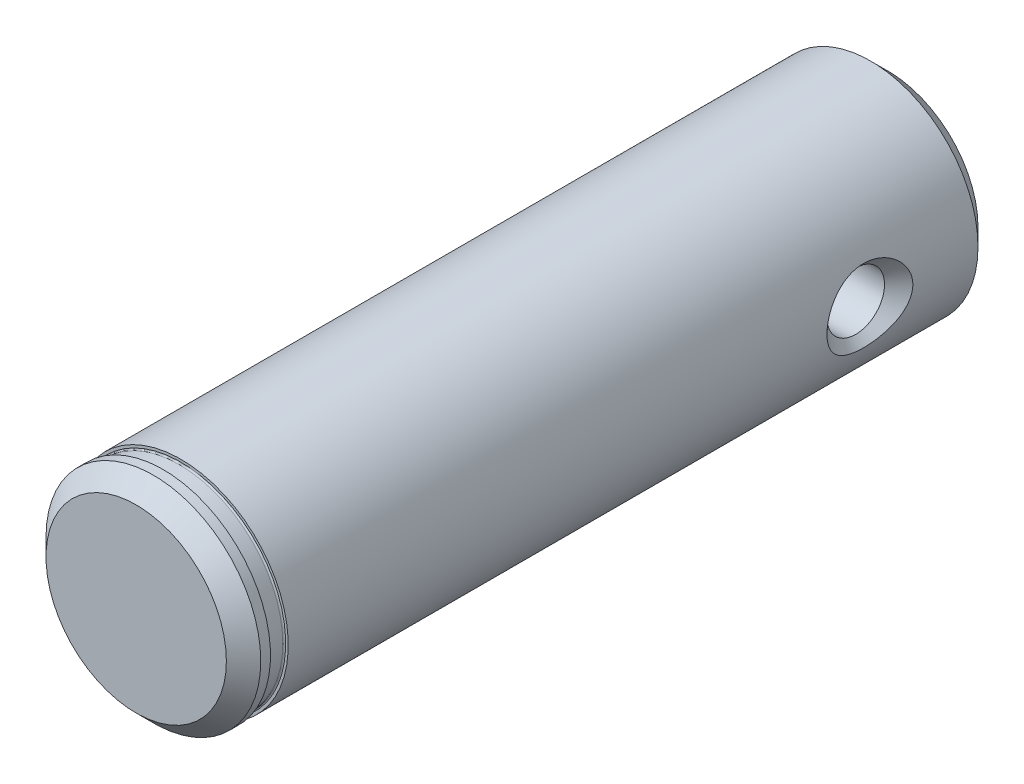
ISO-10303-21;
HEADER;
FILE_DESCRIPTION(('STEP AP214'),'2;1');
FILE_NAME('part.step','',(''),(''),'','','');
FILE_SCHEMA(('AUTOMOTIVE_DESIGN { 1 0 10303 214 1 1 1 1 }'));
ENDSEC;
DATA;
#1=APPLICATION_CONTEXT('core data for automotive mechanical design processes');
#2=APPLICATION_PROTOCOL_DEFINITION('international standard','automotive_design',2000,#1);
#3=PRODUCT_CONTEXT('',#1,'mechanical');
#4=PRODUCT('Part','Part','',(#3));
#5=PRODUCT_RELATED_PRODUCT_CATEGORY('part','',(#4));
#6=PRODUCT_DEFINITION_FORMATION('','',#4);
#7=PRODUCT_DEFINITION_CONTEXT('part definition',#1,'design');
#8=PRODUCT_DEFINITION('design','',#6,#7);
#9=PRODUCT_DEFINITION_SHAPE('','',#8);
#10=(LENGTH_UNIT() NAMED_UNIT(*) SI_UNIT(.MILLI.,.METRE.));
#11=(NAMED_UNIT(*) PLANE_ANGLE_UNIT() SI_UNIT($,.RADIAN.));
#12=(NAMED_UNIT(*) SI_UNIT($,.STERADIAN.) SOLID_ANGLE_UNIT());
#13=UNCERTAINTY_MEASURE_WITH_UNIT(LENGTH_MEASURE(1.E-05),#10,'distance_accuracy_value','');
#14=(GEOMETRIC_REPRESENTATION_CONTEXT(3) GLOBAL_UNCERTAINTY_ASSIGNED_CONTEXT((#13)) GLOBAL_UNIT_ASSIGNED_CONTEXT((#10,
#11,#12)) REPRESENTATION_CONTEXT('',''));
#15=CARTESIAN_POINT('',(0.,0.,0.));
#16=DIRECTION('',(0.,0.,1.));
#17=DIRECTION('',(1.,0.,0.));
#18=AXIS2_PLACEMENT_3D('',#15,#16,#17);
#19=CARTESIAN_POINT('',(0.,0.,33.3375));
#20=DIRECTION('',(0.,0.,-1.));
#21=DIRECTION('',(-0.999999999999997,0.,0.));
#22=AXIS2_PLACEMENT_3D('',#19,#20,#21);
#23=CYLINDRICAL_SURFACE('',#22,9.525);
#24=CARTESIAN_POINT('',(0.,0.,-31.8135000000001));
#25=DIRECTION('',(0.,0.,1.));
#26=DIRECTION('',(0.999999999999997,0.,0.));
#27=AXIS2_PLACEMENT_3D('',#24,#25,#26);
#28=CIRCLE('',#27,9.525);
#29=CARTESIAN_POINT('',(9.52499999999997,0.,-31.8135000000001));
#30=VERTEX_POINT('',#29);
#31=EDGE_CURVE('E92',#30,#30,#28,.T.);
#32=ORIENTED_EDGE('',*,*,#31,.T.);
#33=EDGE_LOOP('',(#32));
#34=FACE_BOUND('',#33,.T.);
#35=CARTESIAN_POINT('',(9.20755792645465,-2.43854727594603,-24.7252884752521));
#36=CARTESIAN_POINT('',(9.17258547531027,-2.5706087647036,-24.5476204052515));
#37=CARTESIAN_POINT('',(9.13868817556098,-2.68718536709002,-24.3578502813316));
#38=CARTESIAN_POINT('',(9.07720611024992,-2.88809002655533,-23.960568838353));
#39=CARTESIAN_POINT('',(9.04964078835685,-2.97231927254464,-23.7530054917787));
#40=CARTESIAN_POINT('',(9.00405827750561,-3.10768487004415,-23.3251001943935));
#41=CARTESIAN_POINT('',(8.98609219259038,-3.15864441427868,-23.1046966436473));
#42=CARTESIAN_POINT('',(8.96213837864486,-3.22598708161031,-22.6582429844194));
#43=CARTESIAN_POINT('',(8.95614066287679,-3.24239903280157,-22.4321977431438));
#44=CARTESIAN_POINT('',(8.95685133068977,-3.24044132300322,-21.9728691778709));
#45=CARTESIAN_POINT('',(8.96398074408306,-3.2209191436982,-21.7395903746216));
#46=CARTESIAN_POINT('',(8.99084889975937,-3.14513084333201,-21.2797421316681));
#47=CARTESIAN_POINT('',(9.01059255812835,-3.08885039646646,-21.0531753438416));
#48=CARTESIAN_POINT('',(9.06014538275714,-2.94032286845566,-20.6132172542272));
#49=CARTESIAN_POINT('',(9.08995760698007,-2.84806485910746,-20.3998299785576));
#50=CARTESIAN_POINT('',(9.15586602591945,-2.62846870805686,-19.9927038297507));
#51=CARTESIAN_POINT('',(9.19196574825817,-2.50111084997957,-19.7989760837443));
#52=CARTESIAN_POINT('',(9.26451975480245,-2.21700990592689,-19.444212910647));
#53=CARTESIAN_POINT('',(9.30092939722092,-2.06128511364953,-19.2823585799401));
#54=CARTESIAN_POINT('',(9.36996447619855,-1.7202784913417,-18.9926659597795));
#55=CARTESIAN_POINT('',(9.40259947284643,-1.53507428597607,-18.8647406246626));
#56=CARTESIAN_POINT('',(9.45003891571381,-1.20065538865497,-18.6848290828975));
#57=CARTESIAN_POINT('',(9.46724301617756,-1.05779427435459,-18.621584679286));
#58=CARTESIAN_POINT('',(9.49552848183409,-0.763138797716057,-18.5190480915894));
#59=CARTESIAN_POINT('',(9.50661511848444,-0.611352251696984,-18.4797352824713));
#60=CARTESIAN_POINT('',(9.52146127495425,-0.302326557637647,-18.4273238946441));
#61=CARTESIAN_POINT('',(9.52519296186631,-0.145068980332706,-18.4143248887254));
#62=CARTESIAN_POINT('',(9.52479159968545,0.169321913477662,-18.4157291460057));
#63=CARTESIAN_POINT('',(9.52065859305043,0.32645523064933,-18.430132261273));
#64=CARTESIAN_POINT('',(9.50550142460441,0.626337083463039,-18.4836937930444));
#65=CARTESIAN_POINT('',(9.49490185480529,0.769385259530482,-18.5213285065054));
#66=CARTESIAN_POINT('',(9.46825669310777,1.04751261822017,-18.6179013688692));
#67=CARTESIAN_POINT('',(9.45221001723895,1.18259020841608,-18.6768437581369));
#68=CARTESIAN_POINT('',(9.41487844277305,1.45095341383241,-18.8179547709103));
#69=CARTESIAN_POINT('',(9.39331570759803,1.58351960071094,-18.9014095477386));
#70=CARTESIAN_POINT('',(9.34746336633047,1.83491567501983,-19.0862541130077));
#71=CARTESIAN_POINT('',(9.32317245033989,1.95373890790797,-19.1876525304026));
#72=CARTESIAN_POINT('',(9.26969968910701,2.19450729802335,-19.4228784772532));
#73=CARTESIAN_POINT('',(9.24035945458259,2.31388220319683,-19.5592987861287));
#74=CARTESIAN_POINT('',(9.1830529625815,2.53177306036937,-19.8481381397988));
#75=CARTESIAN_POINT('',(9.15508761115262,2.63027539518342,-20.0005675324805));
#76=CARTESIAN_POINT('',(9.09855672352362,2.82015608736701,-20.3438553515655));
#77=CARTESIAN_POINT('',(9.07063854550548,2.90774610094924,-20.5369249275187));
#78=CARTESIAN_POINT('',(9.02275881580525,3.0530820236464,-20.9349225440429));
#79=CARTESIAN_POINT('',(9.00280015148266,3.11081710496123,-21.1398548570755));
#80=CARTESIAN_POINT('',(8.97176247539926,3.19930349401538,-21.5740637368423));
#81=CARTESIAN_POINT('',(8.96155979331263,3.22741194338253,-21.8039476470058));
#82=CARTESIAN_POINT('',(8.95436003224139,3.24733259242681,-22.265474922543));
#83=CARTESIAN_POINT('',(8.95736342146001,3.23914350522427,-22.4971183500073));
#84=CARTESIAN_POINT('',(8.97628202699606,3.18634175835761,-22.9581424187624));
#85=CARTESIAN_POINT('',(8.99233166721714,3.1413498652063,-23.1874742155547));
#86=CARTESIAN_POINT('',(9.03544054714415,3.01510438592671,-23.6350074594101));
#87=CARTESIAN_POINT('',(9.06250619863306,2.93382967899898,-23.8532023409407));
#88=CARTESIAN_POINT('',(9.12413228120126,2.73615099811477,-24.2715061710074));
#89=CARTESIAN_POINT('',(9.15868021396448,2.61980548055821,-24.4716445006456));
#90=CARTESIAN_POINT('',(9.23080338465862,2.35306020987225,-24.8471355324797));
#91=CARTESIAN_POINT('',(9.2683747695287,2.20270337120611,-25.0225190205726));
#92=CARTESIAN_POINT('',(9.33248563869413,1.90973758852764,-25.3021725409193));
#93=CARTESIAN_POINT('',(9.35951420320457,1.77387864951657,-25.4134179805273));
#94=CARTESIAN_POINT('',(9.40963474091033,1.48519299902468,-25.6124134717282));
#95=CARTESIAN_POINT('',(9.432729347629,1.33237775273217,-25.7001792640181));
#96=CARTESIAN_POINT('',(9.47252758447152,1.01149960138992,-25.8481097411326));
#97=CARTESIAN_POINT('',(9.48917942286959,0.843326039872123,-25.9080514932636));
#98=CARTESIAN_POINT('',(9.51353757165769,0.498034147169199,-25.9949207788077));
#99=CARTESIAN_POINT('',(9.52125253274059,0.320924639410251,-26.0218802397461));
#100=CARTESIAN_POINT('',(9.52624557254948,-0.0113102912056217,-26.0393597580989));
#101=CARTESIAN_POINT('',(9.52478457499457,-0.166198626101539,-26.0342817926266));
#102=CARTESIAN_POINT('',(9.51450141059954,-0.472619945948344,-25.9981415699201));
#103=CARTESIAN_POINT('',(9.50568061426481,-0.624153550208001,-25.967084150449));
#104=CARTESIAN_POINT('',(9.48209564759528,-0.914312088476407,-25.8824518714173));
#105=CARTESIAN_POINT('',(9.4675542971525,-1.05320454177826,-25.8297182068451));
#106=CARTESIAN_POINT('',(9.43389796261108,-1.32115905919184,-25.7044187469914));
#107=CARTESIAN_POINT('',(9.41477988083265,-1.45021438688349,-25.6318395148364));
#108=CARTESIAN_POINT('',(9.37128729200106,-1.70990707930315,-25.460871551448));
#109=CARTESIAN_POINT('',(9.34656755955761,-1.83919763182207,-25.3605372183023));
#110=CARTESIAN_POINT('',(9.2955647349487,-2.08169556914442,-25.1426808352076));
#111=CARTESIAN_POINT('',(9.26928347747393,-2.19492131889036,-25.0251787282798));
#112=CARTESIAN_POINT('',(9.23125643471413,-2.34775991134328,-24.8436867637712));
#113=CARTESIAN_POINT('',(9.21934610315405,-2.39403326238053,-24.7851751155783));
#114=CARTESIAN_POINT('',(9.20755792645465,-2.43854727594603,-24.7252884752521));
#115=B_SPLINE_CURVE_WITH_KNOTS('',3,(#35,#36,#37,#38,#39,#40,#41,#42,#43,#44,#45,#46,#47,#48,
#49,#50,#51,#52,#53,#54,#55,#56,#57,#58,#59,#60,#61,#62,#63,#64,#65,#66,#67,#68,#69,#70,#71,#72,
#73,#74,#75,#76,#77,#78,#79,#80,#81,#82,#83,#84,#85,#86,#87,#88,#89,#90,#91,#92,#93,#94,#95,#96,
#97,#98,#99,#100,#101,#102,#103,#104,#105,#106,#107,#108,#109,#110,#111,#112,#113,#114),
.UNSPECIFIED.,.T.,.F.,(4,2,2,2,2,2,2,2,2,2,2,2,2,2,2,2,2,2,2,2,2,2,2,2,2,2,2,2,2,2,2,2,2,2,2,2,
2,2,2,4),(0.,0.672142994186072,1.34632314699669,2.0240575868911,2.70122626957766,
3.40049323719157,4.10003289296197,4.79978519997516,5.49993137757379,6.17865585190501,
6.85562181917176,7.32522118724444,7.79441526407856,8.26538150138663,8.73634519616857,
9.17929060806374,9.62232421752099,10.0948848645522,10.5676733828755,11.1164847850272,
11.6656531347383,12.3044761788174,12.9435307493085,13.6357223880559,14.3279385677103,
15.0273788864856,15.727226892519,16.4259147748748,17.1237259432736,17.6546164586359,
18.1851501693414,18.719864233138,19.2540602722895,19.7166158681074,20.1790853483249,
20.6250869280724,21.0713912338596,21.566105901064,22.0602503838306,22.2868098648923),.UNSPECIFIED.);
#116=CARTESIAN_POINT('',(9.20755792645465,-2.43854727594603,-24.7252884752521));
#117=VERTEX_POINT('',#116);
#118=EDGE_CURVE('E10',#117,#117,#115,.T.);
#119=ORIENTED_EDGE('',*,*,#118,.T.);
#120=EDGE_LOOP('',(#119));
#121=FACE_BOUND('',#120,.T.);
#122=CARTESIAN_POINT('',(-9.20755792645445,-2.43854727594606,-24.7252884752521));
#123=CARTESIAN_POINT('',(-9.23451671464436,-2.33675557425972,-24.8622236601003));
#124=CARTESIAN_POINT('',(-9.26214874685772,-2.22562591957694,-24.9921702797613));
#125=CARTESIAN_POINT('',(-9.31659686469245,-1.98539669810867,-25.2346672923979));
#126=CARTESIAN_POINT('',(-9.34341259357394,-1.85628940834074,-25.3472101648383));
#127=CARTESIAN_POINT('',(-9.39290594290445,-1.5865141013821,-25.5471233278469));
#128=CARTESIAN_POINT('',(-9.41569940194298,-1.44644510854815,-25.6352665541491));
#129=CARTESIAN_POINT('',(-9.45609522727119,-1.15314476869144,-25.7877127090757));
#130=CARTESIAN_POINT('',(-9.47370034484155,-0.999920453560326,-25.8520282777319));
#131=CARTESIAN_POINT('',(-9.50182302699517,-0.682938151732362,-25.953439799313));
#132=CARTESIAN_POINT('',(-9.51229690219313,-0.519121848281437,-25.9903680855313));
#133=CARTESIAN_POINT('',(-9.52460478064567,-0.187188569671563,-26.0336717116727));
#134=CARTESIAN_POINT('',(-9.52644353884103,-0.0190740126457397,-26.0400638663981));
#135=CARTESIAN_POINT('',(-9.5215266749095,0.29768080365999,-26.0228297055283));
#136=CARTESIAN_POINT('',(-9.51565251336415,0.446513705735653,-26.0022824905089));
#137=CARTESIAN_POINT('',(-9.49745263690035,0.738531673019781,-25.9376541695073));
#138=CARTESIAN_POINT('',(-9.48512637979525,0.881716262498056,-25.8935710857376));
#139=CARTESIAN_POINT('',(-9.45504472312712,1.16093471275145,-25.7834788880186));
#140=CARTESIAN_POINT('',(-9.43721879347429,1.29684705887281,-25.7171839097768));
#141=CARTESIAN_POINT('',(-9.39778988281086,1.55708850256225,-25.5657660625141));
#142=CARTESIAN_POINT('',(-9.37618551321706,1.68141331585356,-25.4806362686068));
#143=CARTESIAN_POINT('',(-9.32777020554511,1.93311458931574,-25.2817348118065));
#144=CARTESIAN_POINT('',(-9.30065111321744,2.05859095473137,-25.165639659558));
#145=CARTESIAN_POINT('',(-9.24601725163215,2.29153462919052,-24.9167111877114));
#146=CARTESIAN_POINT('',(-9.21850224378314,2.39899053878289,-24.7838673655439));
#147=CARTESIAN_POINT('',(-9.16056707588252,2.61225986362591,-24.4804632948592));
#148=CARTESIAN_POINT('',(-9.13047171913943,2.71455022176512,-24.3073588813172));
#149=CARTESIAN_POINT('',(-9.0756240304316,2.89263958870514,-23.947229936712));
#150=CARTESIAN_POINT('',(-9.05087449140125,2.96842476255387,-23.7601981975724));
#151=CARTESIAN_POINT('',(-9.00665987649716,3.10018510919538,-23.3537709345053));
#152=CARTESIAN_POINT('',(-8.98816302600154,3.15276731275575,-23.133160762753));
#153=CARTESIAN_POINT('',(-8.96313824834261,3.22322535969072,-22.6858124853161));
#154=CARTESIAN_POINT('',(-8.95661162311146,3.24109742785711,-22.4590737157806));
#155=CARTESIAN_POINT('',(-8.95634052798863,3.24185301477475,-21.9989239493244));
#156=CARTESIAN_POINT('',(-8.96297212145603,3.22370713091775,-21.7655100919462));
#157=CARTESIAN_POINT('',(-8.98890842572999,3.15065439078666,-21.3051998460783));
#158=CARTESIAN_POINT('',(-9.00821530825005,3.09574123498076,-21.0783045814026));
#159=CARTESIAN_POINT('',(-9.0570152336768,2.94991385328249,-20.63740594131));
#160=CARTESIAN_POINT('',(-9.08651319481821,2.85898224170176,-20.4234088492485));
#161=CARTESIAN_POINT('',(-9.15195494309578,2.64199766506623,-20.0148012174776));
#162=CARTESIAN_POINT('',(-9.18790263856143,2.51592337890524,-19.820202544425));
#163=CARTESIAN_POINT('',(-9.26040206991308,2.23408417236524,-19.4631669639533));
#164=CARTESIAN_POINT('',(-9.29690568171728,2.0792914606158,-19.299958121617));
#165=CARTESIAN_POINT('',(-9.36631886450851,1.73994286337332,-19.0073236175286));
#166=CARTESIAN_POINT('',(-9.39923739615992,1.5554641784315,-18.8778125486594));
#167=CARTESIAN_POINT('',(-9.44731920220784,1.22184754836608,-18.6949471327562));
#168=CARTESIAN_POINT('',(-9.46483433001318,1.07913316803813,-18.630414312315));
#169=CARTESIAN_POINT('',(-9.4937831626442,0.784552134266316,-18.5252893852725));
#170=CARTESIAN_POINT('',(-9.505222137006,0.63269353882291,-18.4846765307746));
#171=CARTESIAN_POINT('',(-9.5207772156579,0.323260875406232,-18.4297174757089));
#172=CARTESIAN_POINT('',(-9.52486449442217,0.165666770433504,-18.4154746640102));
#173=CARTESIAN_POINT('',(-9.52512874509994,-0.149617633128297,-18.4145489977033));
#174=CARTESIAN_POINT('',(-9.52130591595756,-0.307307929198388,-18.4278654499624));
#175=CARTESIAN_POINT('',(-9.50669290498769,-0.608031750287398,-18.4794671732832));
#176=CARTESIAN_POINT('',(-9.49634948102034,-0.751367776316251,-18.5161528777741));
#177=CARTESIAN_POINT('',(-9.47016138360349,-1.03019491780133,-18.6109357896709));
#178=CARTESIAN_POINT('',(-9.45431565128768,-1.1656845174285,-18.6690371184399));
#179=CARTESIAN_POINT('',(-9.41738285722367,-1.4346171002413,-18.8083453465884));
#180=CARTESIAN_POINT('',(-9.39602575810953,-1.56737716786606,-18.8907905641122));
#181=CARTESIAN_POINT('',(-9.35052041541344,-1.8192888321997,-19.0736607820853));
#182=CARTESIAN_POINT('',(-9.32637084756102,-1.93843391859517,-19.1740943256213));
#183=CARTESIAN_POINT('',(-9.27315070843079,-2.17989539301947,-19.4071750162596));
#184=CARTESIAN_POINT('',(-9.24391023057239,-2.29967874006782,-19.5424052128047));
#185=CARTESIAN_POINT('',(-9.18669153646095,-2.51855937503857,-19.8289132043034));
#186=CARTESIAN_POINT('',(-9.15871416678243,-2.61764294605171,-19.9802015408502));
#187=CARTESIAN_POINT('',(-9.10200135126804,-2.80905120178875,-20.3212428042105));
#188=CARTESIAN_POINT('',(-9.07389598185727,-2.89759351809486,-20.5132323199009));
#189=CARTESIAN_POINT('',(-9.02549409003493,-3.04501357231053,-20.909196885819));
#190=CARTESIAN_POINT('',(-9.00519989098383,-3.10388248574997,-21.1131754813239));
#191=CARTESIAN_POINT('',(-8.97330155493622,-3.19500718181075,-21.5459663440732));
#192=CARTESIAN_POINT('',(-8.96258259851457,-3.22457582293422,-21.7754158093595));
#193=CARTESIAN_POINT('',(-8.95430288630963,-3.2474960649008,-22.2364417636234));
#194=CARTESIAN_POINT('',(-8.95674810742174,-3.24083121473785,-22.4680191711022));
#195=CARTESIAN_POINT('',(-8.97459035501953,-3.19108924769888,-22.9295088181309));
#196=CARTESIAN_POINT('',(-8.99014174113607,-3.14757813948706,-23.1593681255274));
#197=CARTESIAN_POINT('',(-9.0323683268254,-3.02426363645974,-23.6078626029231));
#198=CARTESIAN_POINT('',(-9.05902869745206,-2.94450860941315,-23.8265123008574));
#199=CARTESIAN_POINT('',(-9.10717332947638,-2.7907796568084,-24.1579015789287));
#200=CARTESIAN_POINT('',(-9.12612683312931,-2.72845297606283,-24.276545317653));
#201=CARTESIAN_POINT('',(-9.16576897769225,-2.59217176740716,-24.5066482467045));
#202=CARTESIAN_POINT('',(-9.18645722989879,-2.51821984112354,-24.6181090366617));
#203=CARTESIAN_POINT('',(-9.20755792645445,-2.43854727594606,-24.7252884752521));
#204=B_SPLINE_CURVE_WITH_KNOTS('',3,(#122,#123,#124,#125,#126,#127,#128,#129,#130,#131,#132,
#133,#134,#135,#136,#137,#138,#139,#140,#141,#142,#143,#144,#145,#146,#147,#148,#149,#150,#151,
#152,#153,#154,#155,#156,#157,#158,#159,#160,#161,#162,#163,#164,#165,#166,#167,#168,#169,#170,
#171,#172,#173,#174,#175,#176,#177,#178,#179,#180,#181,#182,#183,#184,#185,#186,#187,#188,#189,
#190,#191,#192,#193,#194,#195,#196,#197,#198,#199,#200,#201,#202,#203),.UNSPECIFIED.,.T.,.F.,(4,
2,2,2,2,2,2,2,2,2,2,2,2,2,2,2,2,2,2,2,2,2,2,2,2,2,2,2,2,2,2,2,2,2,2,2,2,2,2,2,4),(0.,
0.517893136407196,1.03600944401432,1.53508989636076,2.03390521747406,2.53574966475766,
3.03731773817736,3.48626253413617,3.93524506217074,4.39024332943702,4.84540916207044,
5.36270798287335,5.88033281423796,6.48781101237573,7.09560582526579,7.77512294697947,
8.45471397145803,9.15400755678867,9.85342098647013,10.5531724270528,11.2533493352473,
11.9331236766447,12.611157965319,13.0820289543111,13.5524909115572,14.0247935317116,
14.4970842733071,14.9400874647894,15.383175955262,15.854552715694,16.3261539407295,
16.8730808425606,17.4203690292438,18.0575373061697,18.694894956726,19.3864227423598,
20.0782645269269,20.7783703190712,21.4775445462928,21.8829911295779,22.28834710636),.UNSPECIFIED.);
#205=CARTESIAN_POINT('',(-9.20755792645445,-2.43854727594606,-24.7252884752521));
#206=VERTEX_POINT('',#205);
#207=EDGE_CURVE('E43',#206,#206,#204,.T.);
#208=ORIENTED_EDGE('',*,*,#207,.T.);
#209=EDGE_LOOP('',(#208));
#210=FACE_BOUND('',#209,.T.);
#211=CARTESIAN_POINT('',(0.,0.,29.3751));
#212=DIRECTION('',(0.,0.,-1.));
#213=DIRECTION('',(-0.999999999999997,0.,0.));
#214=AXIS2_PLACEMENT_3D('',#211,#212,#213);
#215=CIRCLE('',#214,9.52499999999999);
#216=CARTESIAN_POINT('',(-9.52499999999996,0.,29.3751));
#217=VERTEX_POINT('',#216);
#218=EDGE_CURVE('E105',#217,#217,#215,.T.);
#219=ORIENTED_EDGE('',*,*,#218,.T.);
#220=EDGE_LOOP('',(#219));
#221=FACE_BOUND('',#220,.T.);
#222=ADVANCED_FACE('F32',(#34,#121,#210,#221),#23,.T.);
#223=CARTESIAN_POINT('',(0.,0.,-33.3375));
#224=DIRECTION('',(0.,0.,1.));
#225=DIRECTION('',(0.999999999999997,0.,0.));
#226=AXIS2_PLACEMENT_3D('',#223,#224,#225);
#227=PLANE('',#226);
#228=CARTESIAN_POINT('',(0.,0.,-33.3375));
#229=DIRECTION('',(0.,0.,1.));
#230=DIRECTION('',(0.999999999999997,0.,0.));
#231=AXIS2_PLACEMENT_3D('',#228,#229,#230);
#232=CIRCLE('',#231,8.00099999999999);
#233=CARTESIAN_POINT('',(8.00099999999997,0.,-33.3375));
#234=VERTEX_POINT('',#233);
#235=EDGE_CURVE('E51',#234,#234,#232,.F.);
#236=ORIENTED_EDGE('',*,*,#235,.T.);
#237=EDGE_LOOP('',(#236));
#238=FACE_BOUND('',#237,.T.);
#239=ADVANCED_FACE('F80',(#238),#227,.F.);
#240=CARTESIAN_POINT('',(0.,0.,-31.8135000000001));
#241=DIRECTION('',(0.,0.,1.));
#242=DIRECTION('',(0.999999999999997,0.,0.));
#243=AXIS2_PLACEMENT_3D('',#240,#241,#242);
#244=CONICAL_SURFACE('',#243,9.525,0.785398163397451);
#245=ORIENTED_EDGE('',*,*,#235,.F.);
#246=EDGE_LOOP('',(#245));
#247=FACE_BOUND('',#246,.T.);
#248=ORIENTED_EDGE('',*,*,#31,.F.);
#249=EDGE_LOOP('',(#248));
#250=FACE_BOUND('',#249,.T.);
#251=ADVANCED_FACE('F74',(#247,#250),#244,.T.);
#252=CARTESIAN_POINT('',(8.26769999999985,0.,-22.2250000000001));
#253=DIRECTION('',(0.999999999999997,0.,0.));
#254=DIRECTION('',(0.,0.,-1.));
#255=AXIS2_PLACEMENT_3D('',#252,#253,#254);
#256=CONICAL_SURFACE('',#255,2.55269999999999,0.785398163397446);
#257=CARTESIAN_POINT('',(8.26769999999985,0.,-22.2250000000001));
#258=DIRECTION('',(-0.999999999999997,0.,0.));
#259=DIRECTION('',(0.,0.,1.));
#260=AXIS2_PLACEMENT_3D('',#257,#258,#259);
#261=CIRCLE('',#260,2.55269999999999);
#262=CARTESIAN_POINT('',(8.26769999999985,0.,-19.6723000000001));
#263=VERTEX_POINT('',#262);
#264=EDGE_CURVE('E99',#263,#263,#261,.T.);
#265=ORIENTED_EDGE('',*,*,#264,.T.);
#266=EDGE_LOOP('',(#265));
#267=FACE_BOUND('',#266,.T.);
#268=ORIENTED_EDGE('',*,*,#118,.F.);
#269=EDGE_LOOP('',(#268));
#270=FACE_BOUND('',#269,.T.);
#271=ADVANCED_FACE('F65',(#267,#270),#256,.F.);
#272=CARTESIAN_POINT('',(-9.52499999999992,0.,-22.2250000000001));
#273=DIRECTION('',(-0.999999999999997,0.,0.));
#274=DIRECTION('',(0.,0.,1.));
#275=AXIS2_PLACEMENT_3D('',#272,#273,#274);
#276=CONICAL_SURFACE('',#275,3.81,0.785398163397451);
#277=CARTESIAN_POINT('',(-8.2677,0.,-22.2250000000001));
#278=DIRECTION('',(-0.999999999999997,0.,0.));
#279=DIRECTION('',(0.,0.,1.));
#280=AXIS2_PLACEMENT_3D('',#277,#278,#279);
#281=CIRCLE('',#280,2.55269999999999);
#282=CARTESIAN_POINT('',(-8.2677,0.,-19.6723000000001));
#283=VERTEX_POINT('',#282);
#284=EDGE_CURVE('E102',#283,#283,#281,.T.);
#285=ORIENTED_EDGE('',*,*,#284,.F.);
#286=EDGE_LOOP('',(#285));
#287=FACE_BOUND('',#286,.T.);
#288=ORIENTED_EDGE('',*,*,#207,.F.);
#289=EDGE_LOOP('',(#288));
#290=FACE_BOUND('',#289,.T.);
#291=ADVANCED_FACE('F59',(#287,#290),#276,.F.);
#292=CARTESIAN_POINT('',(-9.52499999999992,0.,-22.2250000000001));
#293=DIRECTION('',(-0.999999999999997,0.,0.));
#294=DIRECTION('',(0.,0.,1.));
#295=AXIS2_PLACEMENT_3D('',#292,#293,#294);
#296=CYLINDRICAL_SURFACE('',#295,2.55269999999999);
#297=CARTESIAN_POINT('',(8.26769999999985,0.,-19.6723000000001));
#298=CARTESIAN_POINT('',(8.09545624999985,0.,-19.6723000000001));
#299=CARTESIAN_POINT('',(7.92321249999985,0.,-19.6723000000001));
#300=CARTESIAN_POINT('',(7.57872499999986,0.,-19.6723000000001));
#301=CARTESIAN_POINT('',(7.40648124999986,0.,-19.6723000000001));
#302=CARTESIAN_POINT('',(7.06199374999986,0.,-19.6723000000001));
#303=CARTESIAN_POINT('',(6.88974999999986,0.,-19.6723000000001));
#304=CARTESIAN_POINT('',(6.54526249999986,0.,-19.6723000000001));
#305=CARTESIAN_POINT('',(6.37301874999987,0.,-19.6723000000001));
#306=CARTESIAN_POINT('',(6.02853124999987,0.,-19.6723000000001));
#307=CARTESIAN_POINT('',(5.85628749999987,0.,-19.6723000000001));
#308=CARTESIAN_POINT('',(5.51179999999987,0.,-19.6723000000001));
#309=CARTESIAN_POINT('',(5.33955624999988,0.,-19.6723000000001));
#310=CARTESIAN_POINT('',(4.99506874999988,0.,-19.6723000000001));
#311=CARTESIAN_POINT('',(4.82282499999988,0.,-19.6723000000001));
#312=CARTESIAN_POINT('',(4.47833749999988,0.,-19.6723000000001));
#313=CARTESIAN_POINT('',(4.30609374999989,0.,-19.6723000000001));
#314=CARTESIAN_POINT('',(3.96160624999989,0.,-19.6723000000001));
#315=CARTESIAN_POINT('',(3.78936249999989,0.,-19.6723000000001));
#316=CARTESIAN_POINT('',(3.44487499999989,0.,-19.6723000000001));
#317=CARTESIAN_POINT('',(3.27263124999989,0.,-19.6723000000001));
#318=CARTESIAN_POINT('',(2.9281437499999,0.,-19.6723000000001));
#319=CARTESIAN_POINT('',(2.7558999999999,0.,-19.6723000000001));
#320=CARTESIAN_POINT('',(2.4114124999999,0.,-19.6723000000001));
#321=CARTESIAN_POINT('',(2.2391687499999,0.,-19.6723000000001));
#322=CARTESIAN_POINT('',(1.89468124999991,0.,-19.6723000000001));
#323=CARTESIAN_POINT('',(1.72243749999991,0.,-19.6723000000001));
#324=CARTESIAN_POINT('',(1.37794999999991,0.,-19.6723000000001));
#325=CARTESIAN_POINT('',(1.20570624999991,0.,-19.6723000000001));
#326=CARTESIAN_POINT('',(0.861218749999916,0.,-19.6723000000001));
#327=CARTESIAN_POINT('',(0.688974999999918,0.,-19.6723000000001));
#328=CARTESIAN_POINT('',(0.344487499999921,0.,-19.6723000000001));
#329=CARTESIAN_POINT('',(0.172243749999922,0.,-19.6723000000001));
#330=CARTESIAN_POINT('',(-0.172243750000075,0.,-19.6723000000001));
#331=CARTESIAN_POINT('',(-0.344487500000074,0.,-19.6723000000001));
#332=CARTESIAN_POINT('',(-0.68897500000007,0.,-19.6723000000001));
#333=CARTESIAN_POINT('',(-0.861218750000068,0.,-19.6723000000001));
#334=CARTESIAN_POINT('',(-1.20570625000006,0.,-19.6723000000001));
#335=CARTESIAN_POINT('',(-1.37795000000006,0.,-19.6723000000001));
#336=CARTESIAN_POINT('',(-1.72243750000006,0.,-19.6723000000001));
#337=CARTESIAN_POINT('',(-1.89468125000006,0.,-19.6723000000001));
#338=CARTESIAN_POINT('',(-2.23916875000006,0.,-19.6723000000001));
#339=CARTESIAN_POINT('',(-2.41141250000005,0.,-19.6723000000001));
#340=CARTESIAN_POINT('',(-2.75590000000005,0.,-19.6723000000001));
#341=CARTESIAN_POINT('',(-2.92814375000005,0.,-19.6723000000001));
#342=CARTESIAN_POINT('',(-3.27263125000005,0.,-19.6723000000001));
#343=CARTESIAN_POINT('',(-3.44487500000005,0.,-19.6723000000001));
#344=CARTESIAN_POINT('',(-3.78936250000004,0.,-19.6723000000001));
#345=CARTESIAN_POINT('',(-3.96160625000004,0.,-19.6723000000001));
#346=CARTESIAN_POINT('',(-4.30609375000004,0.,-19.6723000000001));
#347=CARTESIAN_POINT('',(-4.47833750000004,0.,-19.6723000000001));
#348=CARTESIAN_POINT('',(-4.82282500000003,0.,-19.6723000000001));
#349=CARTESIAN_POINT('',(-4.99506875000003,0.,-19.6723000000001));
#350=CARTESIAN_POINT('',(-5.33955625000003,0.,-19.6723000000001));
#351=CARTESIAN_POINT('',(-5.51180000000003,0.,-19.6723000000001));
#352=CARTESIAN_POINT('',(-5.85628750000002,0.,-19.6723000000001));
#353=CARTESIAN_POINT('',(-6.02853125000002,0.,-19.6723000000001));
#354=CARTESIAN_POINT('',(-6.37301875000002,0.,-19.6723000000001));
#355=CARTESIAN_POINT('',(-6.54526250000002,0.,-19.6723000000001));
#356=CARTESIAN_POINT('',(-6.88975000000002,0.,-19.6723000000001));
#357=CARTESIAN_POINT('',(-7.06199375000001,0.,-19.6723000000001));
#358=CARTESIAN_POINT('',(-7.40648125000001,0.,-19.6723000000001));
#359=CARTESIAN_POINT('',(-7.57872500000001,0.,-19.6723000000001));
#360=CARTESIAN_POINT('',(-7.92321250000001,0.,-19.6723000000001));
#361=CARTESIAN_POINT('',(-8.09545625,0.,-19.6723000000001));
#362=CARTESIAN_POINT('',(-8.2677,0.,-19.6723000000001));
#363=B_SPLINE_CURVE_WITH_KNOTS('',3,(#297,#298,#299,#300,#301,#302,#303,#304,#305,#306,#307,
#308,#309,#310,#311,#312,#313,#314,#315,#316,#317,#318,#319,#320,#321,#322,#323,#324,#325,#326,
#327,#328,#329,#330,#331,#332,#333,#334,#335,#336,#337,#338,#339,#340,#341,#342,#343,#344,#345,
#346,#347,#348,#349,#350,#351,#352,#353,#354,#355,#356,#357,#358,#359,#360,#361,#362),
.UNSPECIFIED.,.F.,.F.,(4,2,2,2,2,2,2,2,2,2,2,2,2,2,2,2,2,2,2,2,2,2,2,2,2,2,2,2,2,2,2,2,4),(0.,
0.516731249999992,1.03346249999999,1.55019374999999,2.06692499999998,2.58365624999998,
3.10038749999997,3.61711874999997,4.13384999999996,4.65058124999996,5.16731249999996,
5.68404374999995,6.20077499999995,6.71750624999994,7.23423749999994,7.75096874999993,
8.26769999999993,8.78443124999992,9.30116249999992,9.81789374999991,10.3346249999999,
10.8513562499999,11.3680874999999,11.8848187499999,12.4015499999999,12.9182812499999,
13.4350124999999,13.9517437499999,14.4684749999999,14.9852062499999,15.5019374999999,
16.0186687499999,16.5353999999999),.UNSPECIFIED.);
#364=EDGE_CURVE('BSEAM64',#263,#283,#363,.T.);
#365=ORIENTED_EDGE('',*,*,#264,.F.);
#366=ORIENTED_EDGE('',*,*,#284,.T.);
#367=ORIENTED_EDGE('',*,*,#364,.T.);
#368=ORIENTED_EDGE('',*,*,#364,.F.);
#369=EDGE_LOOP('',(#365,#367,#366,#368));
#370=FACE_BOUND('',#369,.T.);
#371=ADVANCED_FACE('F64',(#370),#296,.F.);
#372=CARTESIAN_POINT('',(-9.1844385723904,-2.52422524945486,29.3751));
#373=DIRECTION('',(0.,0.,1.));
#374=DIRECTION('',(0.999999999999997,0.,0.));
#375=AXIS2_PLACEMENT_3D('',#372,#373,#374);
#376=PLANE('',#375);
#377=CARTESIAN_POINT('',(0.,0.,29.3751));
#378=DIRECTION('',(0.,0.,-1.));
#379=DIRECTION('',(-0.999999999999997,0.,0.));
#380=AXIS2_PLACEMENT_3D('',#377,#378,#379);
#381=CIRCLE('',#380,9.29639999999999);
#382=CARTESIAN_POINT('',(-9.29639999999996,0.,29.3751));
#383=VERTEX_POINT('',#382);
#384=EDGE_CURVE('E108',#383,#383,#381,.T.);
#385=ORIENTED_EDGE('',*,*,#384,.T.);
#386=EDGE_LOOP('',(#385));
#387=FACE_BOUND('',#386,.T.);
#388=ORIENTED_EDGE('',*,*,#218,.F.);
#389=EDGE_LOOP('',(#388));
#390=FACE_BOUND('',#389,.T.);
#391=ADVANCED_FACE('F67',(#387,#390),#376,.T.);
#392=CARTESIAN_POINT('',(0.,0.,29.5021));
#393=DIRECTION('',(0.,0.,-1.));
#394=DIRECTION('',(-0.999999999999997,0.,0.));
#395=AXIS2_PLACEMENT_3D('',#392,#393,#394);
#396=TOROIDAL_SURFACE('',#395,9.29639999999999,0.126999999999996);
#397=CARTESIAN_POINT('',(0.,0.,29.5021));
#398=DIRECTION('',(0.,0.,-1.));
#399=DIRECTION('',(-0.999999999999997,0.,0.));
#400=AXIS2_PLACEMENT_3D('',#397,#398,#399);
#401=CIRCLE('',#400,9.1694);
#402=CARTESIAN_POINT('',(-9.16939999999997,0.,29.5021));
#403=VERTEX_POINT('',#402);
#404=EDGE_CURVE('E111',#403,#403,#401,.T.);
#405=ORIENTED_EDGE('',*,*,#404,.T.);
#406=EDGE_LOOP('',(#405));
#407=FACE_BOUND('',#406,.T.);
#408=ORIENTED_EDGE('',*,*,#384,.F.);
#409=EDGE_LOOP('',(#408));
#410=FACE_BOUND('',#409,.T.);
#411=ADVANCED_FACE('F162',(#407,#410),#396,.F.);
#412=CARTESIAN_POINT('',(0.,0.,54.7574011284863));
#413=DIRECTION('',(0.,0.,-1.));
#414=DIRECTION('',(-0.999999999999997,0.,0.));
#415=AXIS2_PLACEMENT_3D('',#412,#413,#414);
#416=CYLINDRICAL_SURFACE('',#415,9.1694);
#417=CARTESIAN_POINT('',(0.,0.,30.8229));
#418=DIRECTION('',(0.,0.,-1.));
#419=DIRECTION('',(-0.999999999999997,0.,0.));
#420=AXIS2_PLACEMENT_3D('',#417,#418,#419);
#421=CIRCLE('',#420,9.1694);
#422=CARTESIAN_POINT('',(-9.16939999999997,0.,30.8229));
#423=VERTEX_POINT('',#422);
#424=EDGE_CURVE('E114',#423,#423,#421,.T.);
#425=ORIENTED_EDGE('',*,*,#424,.T.);
#426=EDGE_LOOP('',(#425));
#427=FACE_BOUND('',#426,.T.);
#428=ORIENTED_EDGE('',*,*,#404,.F.);
#429=EDGE_LOOP('',(#428));
#430=FACE_BOUND('',#429,.T.);
#431=ADVANCED_FACE('F154',(#427,#430),#416,.T.);
#432=CARTESIAN_POINT('',(0.,0.,30.8229));
#433=DIRECTION('',(0.,0.,-1.));
#434=DIRECTION('',(-0.999999999999997,0.,0.));
#435=AXIS2_PLACEMENT_3D('',#432,#433,#434);
#436=TOROIDAL_SURFACE('',#435,9.2964,0.127000000000001);
#437=CARTESIAN_POINT('',(0.,0.,30.9499));
#438=DIRECTION('',(0.,0.,-1.));
#439=DIRECTION('',(-0.999999999999997,0.,0.));
#440=AXIS2_PLACEMENT_3D('',#437,#438,#439);
#441=CIRCLE('',#440,9.29639999999999);
#442=CARTESIAN_POINT('',(-9.29639999999996,0.,30.9499));
#443=VERTEX_POINT('',#442);
#444=EDGE_CURVE('E117',#443,#443,#441,.T.);
#445=ORIENTED_EDGE('',*,*,#444,.T.);
#446=EDGE_LOOP('',(#445));
#447=FACE_BOUND('',#446,.T.);
#448=ORIENTED_EDGE('',*,*,#424,.F.);
#449=EDGE_LOOP('',(#448));
#450=FACE_BOUND('',#449,.T.);
#451=ADVANCED_FACE('F147',(#447,#450),#436,.F.);
#452=CARTESIAN_POINT('',(-8.9640120466531,-2.46364384346798,30.9499));
#453=DIRECTION('',(0.,0.,-1.));
#454=DIRECTION('',(-0.999999999999997,0.,0.));
#455=AXIS2_PLACEMENT_3D('',#452,#453,#454);
#456=PLANE('',#455);
#457=CARTESIAN_POINT('',(0.,0.,30.9499));
#458=DIRECTION('',(0.,0.,-1.));
#459=DIRECTION('',(-0.999999999999997,0.,0.));
#460=AXIS2_PLACEMENT_3D('',#457,#458,#459);
#461=CIRCLE('',#460,9.525);
#462=CARTESIAN_POINT('',(-9.52499999999997,0.,30.9499));
#463=VERTEX_POINT('',#462);
#464=EDGE_CURVE('E120',#463,#463,#461,.T.);
#465=ORIENTED_EDGE('',*,*,#464,.T.);
#466=EDGE_LOOP('',(#465));
#467=FACE_BOUND('',#466,.T.);
#468=ORIENTED_EDGE('',*,*,#444,.F.);
#469=EDGE_LOOP('',(#468));
#470=FACE_BOUND('',#469,.T.);
#471=ADVANCED_FACE('F78',(#467,#470),#456,.T.);
#472=CARTESIAN_POINT('',(0.,0.,33.3375));
#473=DIRECTION('',(0.,0.,1.));
#474=DIRECTION('',(0.999999999999997,0.,0.));
#475=AXIS2_PLACEMENT_3D('',#472,#473,#474);
#476=PLANE('',#475);
#477=CARTESIAN_POINT('',(0.,0.,33.3375));
#478=DIRECTION('',(0.,0.,1.));
#479=DIRECTION('',(0.999999999999997,0.,0.));
#480=AXIS2_PLACEMENT_3D('',#477,#478,#479);
#481=CIRCLE('',#480,8.00100000000002);
#482=CARTESIAN_POINT('',(8.00099999999999,0.,33.3375));
#483=VERTEX_POINT('',#482);
#484=EDGE_CURVE('E47',#483,#483,#481,.T.);
#485=ORIENTED_EDGE('',*,*,#484,.T.);
#486=EDGE_LOOP('',(#485));
#487=FACE_BOUND('',#486,.T.);
#488=ADVANCED_FACE('F76',(#487),#476,.T.);
#489=CARTESIAN_POINT('',(0.,0.,33.3375));
#490=DIRECTION('',(0.,0.,-1.));
#491=DIRECTION('',(-0.999999999999997,0.,0.));
#492=AXIS2_PLACEMENT_3D('',#489,#490,#491);
#493=CONICAL_SURFACE('',#492,8.00100000000002,0.785398163397447);
#494=CARTESIAN_POINT('',(0.,0.,31.8135000000001));
#495=DIRECTION('',(0.,0.,1.));
#496=DIRECTION('',(0.999999999999997,0.,0.));
#497=AXIS2_PLACEMENT_3D('',#494,#495,#496);
#498=CIRCLE('',#497,9.525);
#499=CARTESIAN_POINT('',(9.52499999999997,0.,31.8135000000001));
#500=VERTEX_POINT('',#499);
#501=EDGE_CURVE('E94',#500,#500,#498,.F.);
#502=ORIENTED_EDGE('',*,*,#501,.F.);
#503=EDGE_LOOP('',(#502));
#504=FACE_BOUND('',#503,.T.);
#505=ORIENTED_EDGE('',*,*,#484,.F.);
#506=EDGE_LOOP('',(#505));
#507=FACE_BOUND('',#506,.T.);
#508=ADVANCED_FACE('F34',(#504,#507),#493,.T.);
#509=ORIENTED_EDGE('',*,*,#501,.T.);
#510=EDGE_LOOP('',(#509));
#511=FACE_BOUND('',#510,.T.);
#512=ORIENTED_EDGE('',*,*,#464,.F.);
#513=EDGE_LOOP('',(#512));
#514=FACE_BOUND('',#513,.T.);
#515=ADVANCED_FACE('F89',(#511,#514),#23,.T.);
#516=CLOSED_SHELL('',(#222,#239,#251,#271,#291,#371,#391,#411,#431,#451,#471,#488,#508,#515));
#517=MANIFOLD_SOLID_BREP('B2',#516);
#518=ADVANCED_BREP_SHAPE_REPRESENTATION('',(#18,#517),#14);
#519=SHAPE_DEFINITION_REPRESENTATION(#9,#518);
ENDSEC;
END-ISO-10303-21;
